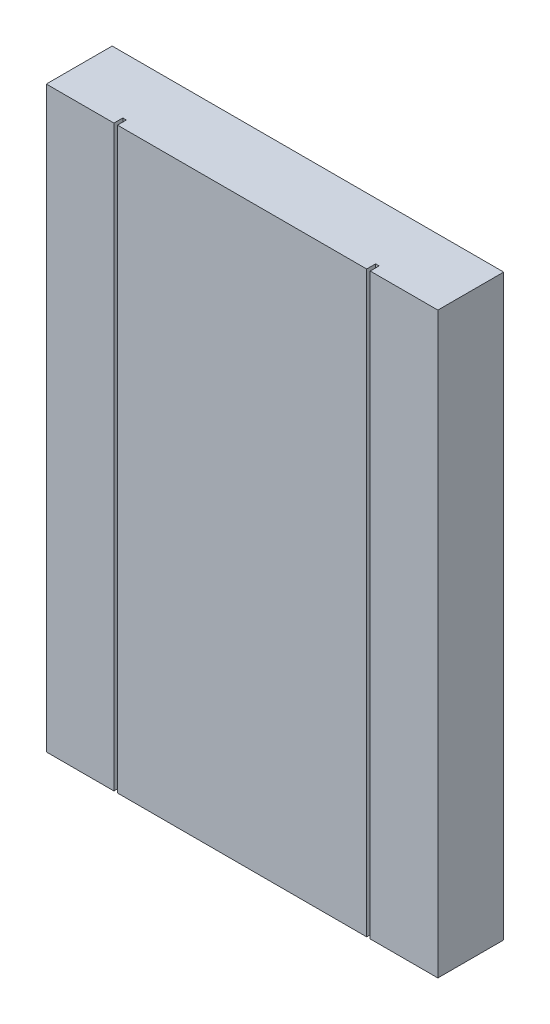
ISO-10303-21;
HEADER;
FILE_DESCRIPTION(('STEP AP214'),'2;1');
FILE_NAME('part.step','',(''),(''),'','','');
FILE_SCHEMA(('AUTOMOTIVE_DESIGN { 1 0 10303 214 1 1 1 1 }'));
ENDSEC;
DATA;
#1=APPLICATION_CONTEXT('core data for automotive mechanical design processes');
#2=APPLICATION_PROTOCOL_DEFINITION('international standard','automotive_design',2000,#1);
#3=PRODUCT_CONTEXT('',#1,'mechanical');
#4=PRODUCT('Part','Part','',(#3));
#5=PRODUCT_RELATED_PRODUCT_CATEGORY('part','',(#4));
#6=PRODUCT_DEFINITION_FORMATION('','',#4);
#7=PRODUCT_DEFINITION_CONTEXT('part definition',#1,'design');
#8=PRODUCT_DEFINITION('design','',#6,#7);
#9=PRODUCT_DEFINITION_SHAPE('','',#8);
#10=(LENGTH_UNIT() NAMED_UNIT(*) SI_UNIT(.MILLI.,.METRE.));
#11=(NAMED_UNIT(*) PLANE_ANGLE_UNIT() SI_UNIT($,.RADIAN.));
#12=(NAMED_UNIT(*) SI_UNIT($,.STERADIAN.) SOLID_ANGLE_UNIT());
#13=UNCERTAINTY_MEASURE_WITH_UNIT(LENGTH_MEASURE(1.E-05),#10,'distance_accuracy_value','');
#14=(GEOMETRIC_REPRESENTATION_CONTEXT(3) GLOBAL_UNCERTAINTY_ASSIGNED_CONTEXT((#13)) GLOBAL_UNIT_ASSIGNED_CONTEXT((#10,
#11,#12)) REPRESENTATION_CONTEXT('',''));
#15=CARTESIAN_POINT('',(0.,0.,0.));
#16=DIRECTION('',(0.,0.,1.));
#17=DIRECTION('',(1.,0.,0.));
#18=AXIS2_PLACEMENT_3D('',#15,#16,#17);
#19=CARTESIAN_POINT('',(0.,0.,9.398));
#20=DIRECTION('',(0.,0.,-1.));
#21=DIRECTION('',(-1.,0.,0.));
#22=AXIS2_PLACEMENT_3D('',#19,#20,#21);
#23=PLANE('',#22);
#24=DIRECTION('',(0.,-1.,0.));
#25=VECTOR('',#24,1.);
#26=CARTESIAN_POINT('',(17.78,0.,9.398));
#27=LINE('',#26,#25);
#28=CARTESIAN_POINT('',(17.78,41.275,9.398));
#29=VERTEX_POINT('',#28);
#30=CARTESIAN_POINT('',(17.78,-41.275,9.398));
#31=VERTEX_POINT('',#30);
#32=EDGE_CURVE('E47',#29,#31,#27,.T.);
#33=ORIENTED_EDGE('',*,*,#32,.F.);
#34=DIRECTION('',(-1.,0.,0.));
#35=VECTOR('',#34,1.);
#36=CARTESIAN_POINT('',(-27.94,41.275,9.398));
#37=LINE('',#36,#35);
#38=CARTESIAN_POINT('',(-17.78,41.275,9.398));
#39=VERTEX_POINT('',#38);
#40=EDGE_CURVE('E186',#29,#39,#37,.T.);
#41=ORIENTED_EDGE('',*,*,#40,.T.);
#42=DIRECTION('',(0.,-1.,0.));
#43=VECTOR('',#42,1.);
#44=CARTESIAN_POINT('',(-17.78,0.,9.398));
#45=LINE('',#44,#43);
#46=CARTESIAN_POINT('',(-17.78,-41.275,9.398));
#47=VERTEX_POINT('',#46);
#48=EDGE_CURVE('E212',#39,#47,#45,.T.);
#49=ORIENTED_EDGE('',*,*,#48,.T.);
#50=DIRECTION('',(1.,0.,0.));
#51=VECTOR('',#50,1.);
#52=CARTESIAN_POINT('',(-27.94,-41.275,9.398));
#53=LINE('',#52,#51);
#54=EDGE_CURVE('E193',#47,#31,#53,.T.);
#55=ORIENTED_EDGE('',*,*,#54,.T.);
#56=EDGE_LOOP('',(#33,#41,#49,#55));
#57=FACE_BOUND('',#56,.T.);
#58=ADVANCED_FACE('F39',(#57),#23,.F.);
#59=CARTESIAN_POINT('',(-27.94,41.275,9.398));
#60=DIRECTION('',(0.,-1.,0.));
#61=DIRECTION('',(0.,0.,-1.));
#62=AXIS2_PLACEMENT_3D('',#59,#60,#61);
#63=PLANE('',#62);
#64=DIRECTION('',(-1.,0.,0.));
#65=VECTOR('',#64,1.);
#66=CARTESIAN_POINT('',(18.288,41.275,8.128));
#67=LINE('',#66,#65);
#68=CARTESIAN_POINT('',(18.288,41.275,8.128));
#69=VERTEX_POINT('',#68);
#70=CARTESIAN_POINT('',(17.78,41.275,8.128));
#71=VERTEX_POINT('',#70);
#72=EDGE_CURVE('E142',#69,#71,#67,.T.);
#73=ORIENTED_EDGE('',*,*,#72,.F.);
#74=DIRECTION('',(0.,0.,-1.));
#75=VECTOR('',#74,1.);
#76=CARTESIAN_POINT('',(18.288,41.275,9.398012));
#77=LINE('',#76,#75);
#78=CARTESIAN_POINT('',(18.288,41.275,9.398));
#79=VERTEX_POINT('',#78);
#80=EDGE_CURVE('E128',#79,#69,#77,.T.);
#81=ORIENTED_EDGE('',*,*,#80,.F.);
#82=CARTESIAN_POINT('',(27.94,41.275,9.398));
#83=VERTEX_POINT('',#82);
#84=EDGE_CURVE('E183',#83,#79,#37,.T.);
#85=ORIENTED_EDGE('',*,*,#84,.F.);
#86=DIRECTION('',(0.,0.,-1.));
#87=VECTOR('',#86,1.);
#88=CARTESIAN_POINT('',(27.94,41.275,9.398));
#89=LINE('',#88,#87);
#90=CARTESIAN_POINT('',(27.94,41.275,0.));
#91=VERTEX_POINT('',#90);
#92=EDGE_CURVE('E209',#83,#91,#89,.T.);
#93=ORIENTED_EDGE('',*,*,#92,.T.);
#94=DIRECTION('',(-1.,0.,0.));
#95=VECTOR('',#94,1.);
#96=CARTESIAN_POINT('',(-27.94,41.275,0.));
#97=LINE('',#96,#95);
#98=CARTESIAN_POINT('',(-27.94,41.275,0.));
#99=VERTEX_POINT('',#98);
#100=EDGE_CURVE('E196',#91,#99,#97,.T.);
#101=ORIENTED_EDGE('',*,*,#100,.T.);
#102=DIRECTION('',(0.,0.,-1.));
#103=VECTOR('',#102,1.);
#104=CARTESIAN_POINT('',(-27.94,41.275,9.398));
#105=LINE('',#104,#103);
#106=CARTESIAN_POINT('',(-27.94,41.275,9.398));
#107=VERTEX_POINT('',#106);
#108=EDGE_CURVE('E206',#107,#99,#105,.T.);
#109=ORIENTED_EDGE('',*,*,#108,.F.);
#110=CARTESIAN_POINT('',(-18.288,41.275,9.398));
#111=VERTEX_POINT('',#110);
#112=EDGE_CURVE('E181',#111,#107,#37,.T.);
#113=ORIENTED_EDGE('',*,*,#112,.F.);
#114=DIRECTION('',(0.,0.,-1.));
#115=VECTOR('',#114,1.);
#116=CARTESIAN_POINT('',(-18.288,41.275,9.398012));
#117=LINE('',#116,#115);
#118=CARTESIAN_POINT('',(-18.288,41.275,8.128));
#119=VERTEX_POINT('',#118);
#120=EDGE_CURVE('E169',#111,#119,#117,.T.);
#121=ORIENTED_EDGE('',*,*,#120,.T.);
#122=DIRECTION('',(1.,0.,0.));
#123=VECTOR('',#122,1.);
#124=CARTESIAN_POINT('',(-18.288,41.275,8.128));
#125=LINE('',#124,#123);
#126=CARTESIAN_POINT('',(-17.78,41.275,8.128));
#127=VERTEX_POINT('',#126);
#128=EDGE_CURVE('E166',#119,#127,#125,.T.);
#129=ORIENTED_EDGE('',*,*,#128,.T.);
#130=DIRECTION('',(0.,0.,-1.));
#131=VECTOR('',#130,1.);
#132=CARTESIAN_POINT('',(-17.78,41.275,9.398012));
#133=LINE('',#132,#131);
#134=EDGE_CURVE('E172',#39,#127,#133,.T.);
#135=ORIENTED_EDGE('',*,*,#134,.F.);
#136=ORIENTED_EDGE('',*,*,#40,.F.);
#137=DIRECTION('',(0.,0.,-1.));
#138=VECTOR('',#137,1.);
#139=CARTESIAN_POINT('',(17.78,41.275,9.398012));
#140=LINE('',#139,#138);
#141=EDGE_CURVE('E54',#29,#71,#140,.T.);
#142=ORIENTED_EDGE('',*,*,#141,.T.);
#143=EDGE_LOOP('',(#73,#81,#85,#93,#101,#109,#113,#121,#129,#135,#136,#142));
#144=FACE_BOUND('',#143,.T.);
#145=ADVANCED_FACE('F147',(#144),#63,.F.);
#146=CARTESIAN_POINT('',(-27.94,-41.275,9.398));
#147=DIRECTION('',(0.,1.,0.));
#148=DIRECTION('',(0.,0.,1.));
#149=AXIS2_PLACEMENT_3D('',#146,#147,#148);
#150=PLANE('',#149);
#151=CARTESIAN_POINT('',(18.288,-41.275,9.398));
#152=VERTEX_POINT('',#151);
#153=CARTESIAN_POINT('',(27.94,-41.275,9.398));
#154=VERTEX_POINT('',#153);
#155=EDGE_CURVE('E188',#152,#154,#53,.T.);
#156=ORIENTED_EDGE('',*,*,#155,.F.);
#157=DIRECTION('',(0.,0.,-1.));
#158=VECTOR('',#157,1.);
#159=CARTESIAN_POINT('',(18.288,-41.275,9.398012));
#160=LINE('',#159,#158);
#161=CARTESIAN_POINT('',(18.288,-41.275,8.128));
#162=VERTEX_POINT('',#161);
#163=EDGE_CURVE('E154',#152,#162,#160,.T.);
#164=ORIENTED_EDGE('',*,*,#163,.T.);
#165=DIRECTION('',(1.,0.,0.));
#166=VECTOR('',#165,1.);
#167=CARTESIAN_POINT('',(17.78,-41.275,8.128));
#168=LINE('',#167,#166);
#169=CARTESIAN_POINT('',(17.78,-41.275,8.128));
#170=VERTEX_POINT('',#169);
#171=EDGE_CURVE('E144',#170,#162,#168,.T.);
#172=ORIENTED_EDGE('',*,*,#171,.F.);
#173=DIRECTION('',(0.,0.,-1.));
#174=VECTOR('',#173,1.);
#175=CARTESIAN_POINT('',(17.78,-41.275,9.398012));
#176=LINE('',#175,#174);
#177=EDGE_CURVE('E156',#31,#170,#176,.T.);
#178=ORIENTED_EDGE('',*,*,#177,.F.);
#179=ORIENTED_EDGE('',*,*,#54,.F.);
#180=DIRECTION('',(0.,0.,-1.));
#181=VECTOR('',#180,1.);
#182=CARTESIAN_POINT('',(-17.78,-41.275,9.398012));
#183=LINE('',#182,#181);
#184=CARTESIAN_POINT('',(-17.78,-41.275,8.128));
#185=VERTEX_POINT('',#184);
#186=EDGE_CURVE('E62',#47,#185,#183,.T.);
#187=ORIENTED_EDGE('',*,*,#186,.T.);
#188=DIRECTION('',(-1.,0.,0.));
#189=VECTOR('',#188,1.);
#190=CARTESIAN_POINT('',(-17.78,-41.275,8.128));
#191=LINE('',#190,#189);
#192=CARTESIAN_POINT('',(-18.288,-41.275,8.128));
#193=VERTEX_POINT('',#192);
#194=EDGE_CURVE('E161',#185,#193,#191,.T.);
#195=ORIENTED_EDGE('',*,*,#194,.T.);
#196=DIRECTION('',(0.,0.,-1.));
#197=VECTOR('',#196,1.);
#198=CARTESIAN_POINT('',(-18.288,-41.275,9.398012));
#199=LINE('',#198,#197);
#200=CARTESIAN_POINT('',(-18.288,-41.275,9.398));
#201=VERTEX_POINT('',#200);
#202=EDGE_CURVE('E175',#201,#193,#199,.T.);
#203=ORIENTED_EDGE('',*,*,#202,.F.);
#204=CARTESIAN_POINT('',(-27.94,-41.275,9.398));
#205=VERTEX_POINT('',#204);
#206=EDGE_CURVE('E189',#205,#201,#53,.T.);
#207=ORIENTED_EDGE('',*,*,#206,.F.);
#208=DIRECTION('',(0.,0.,-1.));
#209=VECTOR('',#208,1.);
#210=CARTESIAN_POINT('',(-27.94,-41.275,9.398));
#211=LINE('',#210,#209);
#212=CARTESIAN_POINT('',(-27.94,-41.275,0.));
#213=VERTEX_POINT('',#212);
#214=EDGE_CURVE('E203',#205,#213,#211,.T.);
#215=ORIENTED_EDGE('',*,*,#214,.T.);
#216=DIRECTION('',(1.,0.,0.));
#217=VECTOR('',#216,1.);
#218=CARTESIAN_POINT('',(-27.94,-41.275,0.));
#219=LINE('',#218,#217);
#220=CARTESIAN_POINT('',(27.94,-41.275,0.));
#221=VERTEX_POINT('',#220);
#222=EDGE_CURVE('E182',#213,#221,#219,.T.);
#223=ORIENTED_EDGE('',*,*,#222,.T.);
#224=DIRECTION('',(0.,0.,-1.));
#225=VECTOR('',#224,1.);
#226=CARTESIAN_POINT('',(27.94,-41.275,9.398));
#227=LINE('',#226,#225);
#228=EDGE_CURVE('E192',#154,#221,#227,.T.);
#229=ORIENTED_EDGE('',*,*,#228,.F.);
#230=EDGE_LOOP('',(#156,#164,#172,#178,#179,#187,#195,#203,#207,#215,#223,#229));
#231=FACE_BOUND('',#230,.T.);
#232=ADVANCED_FACE('F222',(#231),#150,.F.);
#233=DIRECTION('',(0.,-1.,0.));
#234=VECTOR('',#233,1.);
#235=CARTESIAN_POINT('',(-18.288,0.,9.398));
#236=LINE('',#235,#234);
#237=EDGE_CURVE('E214',#111,#201,#236,.T.);
#238=ORIENTED_EDGE('',*,*,#237,.F.);
#239=ORIENTED_EDGE('',*,*,#112,.T.);
#240=DIRECTION('',(0.,-1.,0.));
#241=VECTOR('',#240,1.);
#242=CARTESIAN_POINT('',(-27.94,-41.275,9.398));
#243=LINE('',#242,#241);
#244=EDGE_CURVE('E185',#107,#205,#243,.T.);
#245=ORIENTED_EDGE('',*,*,#244,.T.);
#246=ORIENTED_EDGE('',*,*,#206,.T.);
#247=EDGE_LOOP('',(#238,#239,#245,#246));
#248=FACE_BOUND('',#247,.T.);
#249=ADVANCED_FACE('F253',(#248),#23,.F.);
#250=CARTESIAN_POINT('',(27.94,-41.275,9.398));
#251=DIRECTION('',(-1.,0.,0.));
#252=DIRECTION('',(0.,0.,1.));
#253=AXIS2_PLACEMENT_3D('',#250,#251,#252);
#254=PLANE('',#253);
#255=DIRECTION('',(0.,1.,0.));
#256=VECTOR('',#255,1.);
#257=CARTESIAN_POINT('',(27.94,-41.275,0.));
#258=LINE('',#257,#256);
#259=EDGE_CURVE('E177',#221,#91,#258,.T.);
#260=ORIENTED_EDGE('',*,*,#259,.T.);
#261=ORIENTED_EDGE('',*,*,#92,.F.);
#262=DIRECTION('',(0.,1.,0.));
#263=VECTOR('',#262,1.);
#264=CARTESIAN_POINT('',(27.94,-41.275,9.398));
#265=LINE('',#264,#263);
#266=EDGE_CURVE('E178',#154,#83,#265,.T.);
#267=ORIENTED_EDGE('',*,*,#266,.F.);
#268=ORIENTED_EDGE('',*,*,#228,.T.);
#269=EDGE_LOOP('',(#260,#261,#267,#268));
#270=FACE_BOUND('',#269,.T.);
#271=ADVANCED_FACE('F41',(#270),#254,.F.);
#272=CARTESIAN_POINT('',(-27.94,-41.275,9.398));
#273=DIRECTION('',(1.,0.,0.));
#274=DIRECTION('',(0.,0.,-1.));
#275=AXIS2_PLACEMENT_3D('',#272,#273,#274);
#276=PLANE('',#275);
#277=DIRECTION('',(0.,-1.,0.));
#278=VECTOR('',#277,1.);
#279=CARTESIAN_POINT('',(-27.94,-41.275,0.));
#280=LINE('',#279,#278);
#281=EDGE_CURVE('E198',#99,#213,#280,.T.);
#282=ORIENTED_EDGE('',*,*,#281,.T.);
#283=ORIENTED_EDGE('',*,*,#214,.F.);
#284=ORIENTED_EDGE('',*,*,#244,.F.);
#285=ORIENTED_EDGE('',*,*,#108,.T.);
#286=EDGE_LOOP('',(#282,#283,#284,#285));
#287=FACE_BOUND('',#286,.T.);
#288=ADVANCED_FACE('F237',(#287),#276,.F.);
#289=ORIENTED_EDGE('',*,*,#84,.T.);
#290=DIRECTION('',(0.,-1.,0.));
#291=VECTOR('',#290,1.);
#292=CARTESIAN_POINT('',(18.288,0.,9.398));
#293=LINE('',#292,#291);
#294=EDGE_CURVE('E11',#79,#152,#293,.T.);
#295=ORIENTED_EDGE('',*,*,#294,.T.);
#296=ORIENTED_EDGE('',*,*,#155,.T.);
#297=ORIENTED_EDGE('',*,*,#266,.T.);
#298=EDGE_LOOP('',(#289,#295,#296,#297));
#299=FACE_BOUND('',#298,.T.);
#300=ADVANCED_FACE('F225',(#299),#23,.F.);
#301=CARTESIAN_POINT('',(0.,0.,0.));
#302=DIRECTION('',(0.,0.,-1.));
#303=DIRECTION('',(-1.,0.,0.));
#304=AXIS2_PLACEMENT_3D('',#301,#302,#303);
#305=PLANE('',#304);
#306=ORIENTED_EDGE('',*,*,#259,.F.);
#307=ORIENTED_EDGE('',*,*,#222,.F.);
#308=ORIENTED_EDGE('',*,*,#281,.F.);
#309=ORIENTED_EDGE('',*,*,#100,.F.);
#310=EDGE_LOOP('',(#306,#307,#308,#309));
#311=FACE_BOUND('',#310,.T.);
#312=ADVANCED_FACE('F239',(#311),#305,.T.);
#313=CARTESIAN_POINT('',(-18.288,41.275,9.398012));
#314=DIRECTION('',(1.,0.,0.));
#315=DIRECTION('',(0.,1.,0.));
#316=AXIS2_PLACEMENT_3D('',#313,#314,#315);
#317=PLANE('',#316);
#318=ORIENTED_EDGE('',*,*,#237,.T.);
#319=ORIENTED_EDGE('',*,*,#202,.T.);
#320=DIRECTION('',(0.,-1.,0.));
#321=VECTOR('',#320,1.);
#322=CARTESIAN_POINT('',(-18.288,41.275,8.128));
#323=LINE('',#322,#321);
#324=EDGE_CURVE('E136',#119,#193,#323,.T.);
#325=ORIENTED_EDGE('',*,*,#324,.F.);
#326=ORIENTED_EDGE('',*,*,#120,.F.);
#327=EDGE_LOOP('',(#318,#319,#325,#326));
#328=FACE_BOUND('',#327,.T.);
#329=ADVANCED_FACE('F241',(#328),#317,.T.);
#330=CARTESIAN_POINT('',(-17.78,41.275,9.398012));
#331=DIRECTION('',(1.,0.,0.));
#332=DIRECTION('',(0.,1.,0.));
#333=AXIS2_PLACEMENT_3D('',#330,#331,#332);
#334=PLANE('',#333);
#335=ORIENTED_EDGE('',*,*,#134,.T.);
#336=DIRECTION('',(0.,-1.,0.));
#337=VECTOR('',#336,1.);
#338=CARTESIAN_POINT('',(-17.78,41.275,8.128));
#339=LINE('',#338,#337);
#340=EDGE_CURVE('E164',#127,#185,#339,.T.);
#341=ORIENTED_EDGE('',*,*,#340,.T.);
#342=ORIENTED_EDGE('',*,*,#186,.F.);
#343=ORIENTED_EDGE('',*,*,#48,.F.);
#344=EDGE_LOOP('',(#335,#341,#342,#343));
#345=FACE_BOUND('',#344,.T.);
#346=ADVANCED_FACE('F248',(#345),#334,.F.);
#347=CARTESIAN_POINT('',(0.,0.,8.128));
#348=DIRECTION('',(0.,0.,-1.));
#349=DIRECTION('',(-1.,0.,0.));
#350=AXIS2_PLACEMENT_3D('',#347,#348,#349);
#351=PLANE('',#350);
#352=ORIENTED_EDGE('',*,*,#324,.T.);
#353=ORIENTED_EDGE('',*,*,#194,.F.);
#354=ORIENTED_EDGE('',*,*,#340,.F.);
#355=ORIENTED_EDGE('',*,*,#128,.F.);
#356=EDGE_LOOP('',(#352,#353,#354,#355));
#357=FACE_BOUND('',#356,.T.);
#358=ADVANCED_FACE('F272',(#357),#351,.F.);
#359=CARTESIAN_POINT('',(18.288,41.275,9.398012));
#360=DIRECTION('',(1.,0.,0.));
#361=DIRECTION('',(0.,1.,0.));
#362=AXIS2_PLACEMENT_3D('',#359,#360,#361);
#363=PLANE('',#362);
#364=ORIENTED_EDGE('',*,*,#80,.T.);
#365=DIRECTION('',(0.,-1.,0.));
#366=VECTOR('',#365,1.);
#367=CARTESIAN_POINT('',(18.288,41.275,8.128));
#368=LINE('',#367,#366);
#369=EDGE_CURVE('E131',#69,#162,#368,.T.);
#370=ORIENTED_EDGE('',*,*,#369,.T.);
#371=ORIENTED_EDGE('',*,*,#163,.F.);
#372=ORIENTED_EDGE('',*,*,#294,.F.);
#373=EDGE_LOOP('',(#364,#370,#371,#372));
#374=FACE_BOUND('',#373,.T.);
#375=ADVANCED_FACE('F130',(#374),#363,.F.);
#376=CARTESIAN_POINT('',(17.78,41.275,9.398012));
#377=DIRECTION('',(1.,0.,0.));
#378=DIRECTION('',(0.,1.,0.));
#379=AXIS2_PLACEMENT_3D('',#376,#377,#378);
#380=PLANE('',#379);
#381=ORIENTED_EDGE('',*,*,#32,.T.);
#382=ORIENTED_EDGE('',*,*,#177,.T.);
#383=DIRECTION('',(0.,-1.,0.));
#384=VECTOR('',#383,1.);
#385=CARTESIAN_POINT('',(17.78,41.275,8.128));
#386=LINE('',#385,#384);
#387=EDGE_CURVE('E149',#71,#170,#386,.T.);
#388=ORIENTED_EDGE('',*,*,#387,.F.);
#389=ORIENTED_EDGE('',*,*,#141,.F.);
#390=EDGE_LOOP('',(#381,#382,#388,#389));
#391=FACE_BOUND('',#390,.T.);
#392=ADVANCED_FACE('F216',(#391),#380,.T.);
#393=CARTESIAN_POINT('',(0.,0.,8.128));
#394=DIRECTION('',(0.,0.,-1.));
#395=DIRECTION('',(1.,0.,0.));
#396=AXIS2_PLACEMENT_3D('',#393,#394,#395);
#397=PLANE('',#396);
#398=ORIENTED_EDGE('',*,*,#369,.F.);
#399=ORIENTED_EDGE('',*,*,#72,.T.);
#400=ORIENTED_EDGE('',*,*,#387,.T.);
#401=ORIENTED_EDGE('',*,*,#171,.T.);
#402=EDGE_LOOP('',(#398,#399,#400,#401));
#403=FACE_BOUND('',#402,.T.);
#404=ADVANCED_FACE('F140',(#403),#397,.F.);
#405=CLOSED_SHELL('',(#58,#145,#232,#249,#271,#288,#300,#312,#329,#346,#358,#375,#392,#404));
#406=MANIFOLD_SOLID_BREP('B2',#405);
#407=ADVANCED_BREP_SHAPE_REPRESENTATION('',(#18,#406),#14);
#408=SHAPE_DEFINITION_REPRESENTATION(#9,#407);
ENDSEC;
END-ISO-10303-21;
